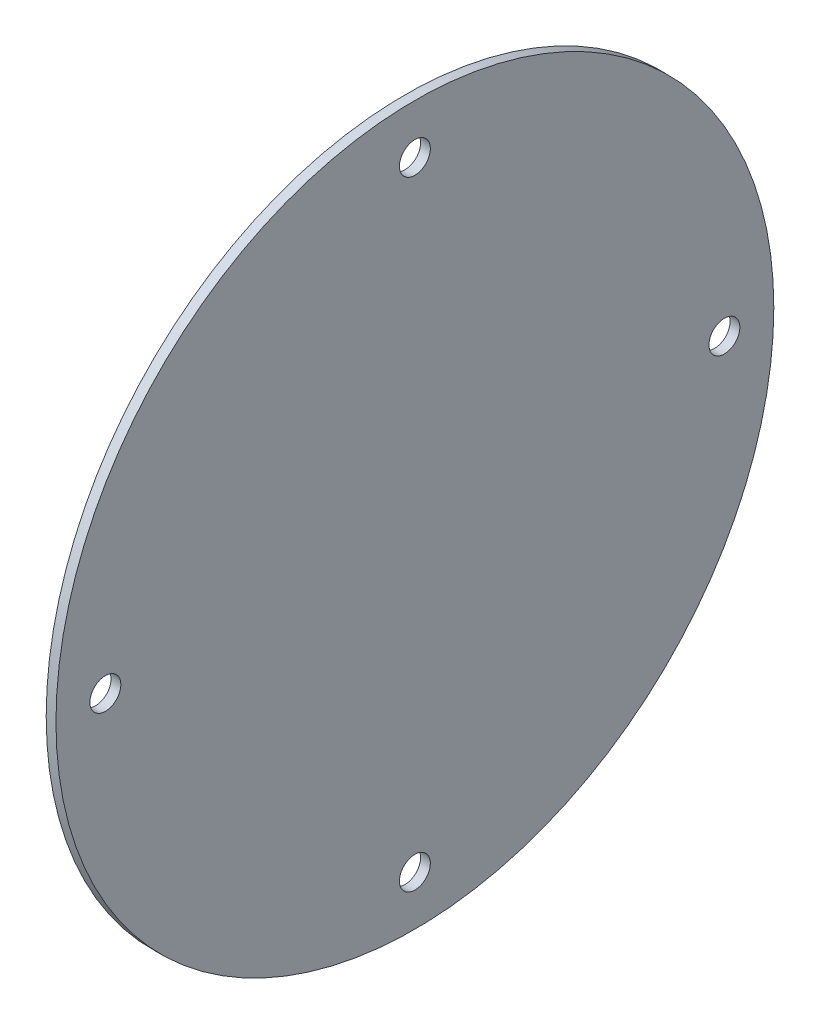
ISO-10303-21;
HEADER;
FILE_DESCRIPTION(('STEP AP214'),'2;1');
FILE_NAME('part.step','',(''),(''),'','','');
FILE_SCHEMA(('AUTOMOTIVE_DESIGN { 1 0 10303 214 1 1 1 1 }'));
ENDSEC;
DATA;
#1=APPLICATION_CONTEXT('core data for automotive mechanical design processes');
#2=APPLICATION_PROTOCOL_DEFINITION('international standard','automotive_design',2000,#1);
#3=PRODUCT_CONTEXT('',#1,'mechanical');
#4=PRODUCT('Part','Part','',(#3));
#5=PRODUCT_RELATED_PRODUCT_CATEGORY('part','',(#4));
#6=PRODUCT_DEFINITION_FORMATION('','',#4);
#7=PRODUCT_DEFINITION_CONTEXT('part definition',#1,'design');
#8=PRODUCT_DEFINITION('design','',#6,#7);
#9=PRODUCT_DEFINITION_SHAPE('','',#8);
#10=(LENGTH_UNIT() NAMED_UNIT(*) SI_UNIT(.MILLI.,.METRE.));
#11=(NAMED_UNIT(*) PLANE_ANGLE_UNIT() SI_UNIT($,.RADIAN.));
#12=(NAMED_UNIT(*) SI_UNIT($,.STERADIAN.) SOLID_ANGLE_UNIT());
#13=UNCERTAINTY_MEASURE_WITH_UNIT(LENGTH_MEASURE(1.E-05),#10,'distance_accuracy_value','');
#14=(GEOMETRIC_REPRESENTATION_CONTEXT(3) GLOBAL_UNCERTAINTY_ASSIGNED_CONTEXT((#13)) GLOBAL_UNIT_ASSIGNED_CONTEXT((#10,
#11,#12)) REPRESENTATION_CONTEXT('',''));
#15=CARTESIAN_POINT('',(0.,0.,0.));
#16=DIRECTION('',(0.,0.,1.));
#17=DIRECTION('',(1.,0.,0.));
#18=AXIS2_PLACEMENT_3D('',#15,#16,#17);
#19=CARTESIAN_POINT('',(2.0066,0.,0.));
#20=DIRECTION('',(-1.,0.,0.));
#21=DIRECTION('',(0.,0.,1.));
#22=AXIS2_PLACEMENT_3D('',#19,#20,#21);
#23=CYLINDRICAL_SURFACE('',#22,73.787);
#24=CARTESIAN_POINT('',(2.0066,0.,0.));
#25=DIRECTION('',(1.,0.,0.));
#26=DIRECTION('',(0.,0.,-1.));
#27=AXIS2_PLACEMENT_3D('',#24,#25,#26);
#28=CIRCLE('',#27,73.787);
#29=CARTESIAN_POINT('',(2.0066,0.,-73.787));
#30=VERTEX_POINT('',#29);
#31=EDGE_CURVE('E11',#30,#30,#28,.T.);
#32=ORIENTED_EDGE('',*,*,#31,.F.);
#33=EDGE_LOOP('',(#32));
#34=FACE_BOUND('',#33,.T.);
#35=CARTESIAN_POINT('',(0.,0.,0.));
#36=DIRECTION('',(1.,0.,0.));
#37=DIRECTION('',(0.,0.,-1.));
#38=AXIS2_PLACEMENT_3D('',#35,#36,#37);
#39=CIRCLE('',#38,73.787);
#40=CARTESIAN_POINT('',(0.,0.,-73.787));
#41=VERTEX_POINT('',#40);
#42=EDGE_CURVE('E49',#41,#41,#39,.T.);
#43=ORIENTED_EDGE('',*,*,#42,.T.);
#44=EDGE_LOOP('',(#43));
#45=FACE_BOUND('',#44,.T.);
#46=ADVANCED_FACE('F46',(#34,#45),#23,.T.);
#47=CARTESIAN_POINT('',(2.0066,0.,0.));
#48=DIRECTION('',(1.,0.,0.));
#49=DIRECTION('',(0.,0.,-1.));
#50=AXIS2_PLACEMENT_3D('',#47,#48,#49);
#51=PLANE('',#50);
#52=CARTESIAN_POINT('',(2.0066,-63.627,-2.22152483146572E-13));
#53=DIRECTION('',(1.,0.,0.));
#54=DIRECTION('',(0.,1.,0.));
#55=AXIS2_PLACEMENT_3D('',#52,#53,#54);
#56=CIRCLE('',#55,3.175);
#57=CARTESIAN_POINT('',(2.0066,-60.452,-2.11067029895745E-13));
#58=VERTEX_POINT('',#57);
#59=EDGE_CURVE('E84',#58,#58,#56,.T.);
#60=ORIENTED_EDGE('',*,*,#59,.F.);
#61=EDGE_LOOP('',(#60));
#62=FACE_BOUND('',#61,.T.);
#63=CARTESIAN_POINT('',(2.0066,0.,-63.627));
#64=DIRECTION('',(1.,0.,0.));
#65=DIRECTION('',(0.,0.,1.));
#66=AXIS2_PLACEMENT_3D('',#63,#64,#65);
#67=CIRCLE('',#66,3.175);
#68=CARTESIAN_POINT('',(2.0066,0.,-60.452));
#69=VERTEX_POINT('',#68);
#70=EDGE_CURVE('E76',#69,#69,#67,.T.);
#71=ORIENTED_EDGE('',*,*,#70,.F.);
#72=EDGE_LOOP('',(#71));
#73=FACE_BOUND('',#72,.T.);
#74=CARTESIAN_POINT('',(2.0066,63.627,6.66457449439716E-13));
#75=DIRECTION('',(1.,0.,0.));
#76=DIRECTION('',(0.,-1.,0.));
#77=AXIS2_PLACEMENT_3D('',#74,#75,#76);
#78=CIRCLE('',#77,3.175);
#79=CARTESIAN_POINT('',(2.0066,60.452,6.33201089687235E-13));
#80=VERTEX_POINT('',#79);
#81=EDGE_CURVE('E68',#80,#80,#78,.T.);
#82=ORIENTED_EDGE('',*,*,#81,.F.);
#83=EDGE_LOOP('',(#82));
#84=FACE_BOUND('',#83,.T.);
#85=CARTESIAN_POINT('',(2.0066,0.,63.627));
#86=DIRECTION('',(1.,0.,0.));
#87=DIRECTION('',(0.,0.,-1.));
#88=AXIS2_PLACEMENT_3D('',#85,#86,#87);
#89=CIRCLE('',#88,3.175);
#90=CARTESIAN_POINT('',(2.0066,0.,60.452));
#91=VERTEX_POINT('',#90);
#92=EDGE_CURVE('E60',#91,#91,#89,.T.);
#93=ORIENTED_EDGE('',*,*,#92,.F.);
#94=EDGE_LOOP('',(#93));
#95=FACE_BOUND('',#94,.T.);
#96=ORIENTED_EDGE('',*,*,#31,.T.);
#97=EDGE_LOOP('',(#96));
#98=FACE_BOUND('',#97,.T.);
#99=ADVANCED_FACE('F102',(#62,#73,#84,#95,#98),#51,.T.);
#100=CARTESIAN_POINT('',(0.,0.,0.));
#101=DIRECTION('',(1.,0.,0.));
#102=DIRECTION('',(0.,0.,-1.));
#103=AXIS2_PLACEMENT_3D('',#100,#101,#102);
#104=PLANE('',#103);
#105=CARTESIAN_POINT('',(0.,-63.627,-2.22152483146572E-13));
#106=DIRECTION('',(1.,0.,0.));
#107=DIRECTION('',(0.,1.,0.));
#108=AXIS2_PLACEMENT_3D('',#105,#106,#107);
#109=CIRCLE('',#108,3.175);
#110=CARTESIAN_POINT('',(0.,-60.452,-2.11067029895745E-13));
#111=VERTEX_POINT('',#110);
#112=EDGE_CURVE('E64',#111,#111,#109,.T.);
#113=ORIENTED_EDGE('',*,*,#112,.T.);
#114=EDGE_LOOP('',(#113));
#115=FACE_BOUND('',#114,.T.);
#116=CARTESIAN_POINT('',(0.,0.,-63.627));
#117=DIRECTION('',(1.,0.,0.));
#118=DIRECTION('',(0.,0.,1.));
#119=AXIS2_PLACEMENT_3D('',#116,#117,#118);
#120=CIRCLE('',#119,3.175);
#121=CARTESIAN_POINT('',(0.,0.,-60.452));
#122=VERTEX_POINT('',#121);
#123=EDGE_CURVE('E80',#122,#122,#120,.T.);
#124=ORIENTED_EDGE('',*,*,#123,.T.);
#125=EDGE_LOOP('',(#124));
#126=FACE_BOUND('',#125,.T.);
#127=CARTESIAN_POINT('',(0.,63.627,6.66457449439716E-13));
#128=DIRECTION('',(1.,0.,0.));
#129=DIRECTION('',(0.,-1.,0.));
#130=AXIS2_PLACEMENT_3D('',#127,#128,#129);
#131=CIRCLE('',#130,3.175);
#132=CARTESIAN_POINT('',(0.,60.452,6.33201089687235E-13));
#133=VERTEX_POINT('',#132);
#134=EDGE_CURVE('E72',#133,#133,#131,.T.);
#135=ORIENTED_EDGE('',*,*,#134,.T.);
#136=EDGE_LOOP('',(#135));
#137=FACE_BOUND('',#136,.T.);
#138=CARTESIAN_POINT('',(0.,0.,63.627));
#139=DIRECTION('',(1.,0.,0.));
#140=DIRECTION('',(0.,0.,-1.));
#141=AXIS2_PLACEMENT_3D('',#138,#139,#140);
#142=CIRCLE('',#141,3.175);
#143=CARTESIAN_POINT('',(0.,0.,60.452));
#144=VERTEX_POINT('',#143);
#145=EDGE_CURVE('E58',#144,#144,#142,.T.);
#146=ORIENTED_EDGE('',*,*,#145,.T.);
#147=EDGE_LOOP('',(#146));
#148=FACE_BOUND('',#147,.T.);
#149=ORIENTED_EDGE('',*,*,#42,.F.);
#150=EDGE_LOOP('',(#149));
#151=FACE_BOUND('',#150,.T.);
#152=ADVANCED_FACE('F92',(#115,#126,#137,#148,#151),#104,.F.);
#153=CARTESIAN_POINT('',(0.,0.,63.627));
#154=DIRECTION('',(1.,0.,0.));
#155=DIRECTION('',(0.,0.,-1.));
#156=AXIS2_PLACEMENT_3D('',#153,#154,#155);
#157=CYLINDRICAL_SURFACE('',#156,3.175);
#158=ORIENTED_EDGE('',*,*,#145,.F.);
#159=EDGE_LOOP('',(#158));
#160=FACE_BOUND('',#159,.T.);
#161=ORIENTED_EDGE('',*,*,#92,.T.);
#162=EDGE_LOOP('',(#161));
#163=FACE_BOUND('',#162,.T.);
#164=ADVANCED_FACE('F112',(#160,#163),#157,.F.);
#165=CARTESIAN_POINT('',(0.,63.627,6.66457449439716E-13));
#166=DIRECTION('',(1.,0.,0.));
#167=DIRECTION('',(0.,0.,-1.));
#168=AXIS2_PLACEMENT_3D('',#165,#166,#167);
#169=CYLINDRICAL_SURFACE('',#168,3.175);
#170=ORIENTED_EDGE('',*,*,#134,.F.);
#171=EDGE_LOOP('',(#170));
#172=FACE_BOUND('',#171,.T.);
#173=ORIENTED_EDGE('',*,*,#81,.T.);
#174=EDGE_LOOP('',(#173));
#175=FACE_BOUND('',#174,.T.);
#176=ADVANCED_FACE('F114',(#172,#175),#169,.F.);
#177=CARTESIAN_POINT('',(0.,0.,-63.627));
#178=DIRECTION('',(1.,0.,0.));
#179=DIRECTION('',(0.,0.,-1.));
#180=AXIS2_PLACEMENT_3D('',#177,#178,#179);
#181=CYLINDRICAL_SURFACE('',#180,3.175);
#182=ORIENTED_EDGE('',*,*,#123,.F.);
#183=EDGE_LOOP('',(#182));
#184=FACE_BOUND('',#183,.T.);
#185=ORIENTED_EDGE('',*,*,#70,.T.);
#186=EDGE_LOOP('',(#185));
#187=FACE_BOUND('',#186,.T.);
#188=ADVANCED_FACE('F98',(#184,#187),#181,.F.);
#189=CARTESIAN_POINT('',(0.,-63.627,-2.22152483146572E-13));
#190=DIRECTION('',(1.,0.,0.));
#191=DIRECTION('',(0.,0.,-1.));
#192=AXIS2_PLACEMENT_3D('',#189,#190,#191);
#193=CYLINDRICAL_SURFACE('',#192,3.175);
#194=ORIENTED_EDGE('',*,*,#112,.F.);
#195=EDGE_LOOP('',(#194));
#196=FACE_BOUND('',#195,.T.);
#197=ORIENTED_EDGE('',*,*,#59,.T.);
#198=EDGE_LOOP('',(#197));
#199=FACE_BOUND('',#198,.T.);
#200=ADVANCED_FACE('F95',(#196,#199),#193,.F.);
#201=CLOSED_SHELL('',(#46,#99,#152,#164,#176,#188,#200));
#202=MANIFOLD_SOLID_BREP('B2',#201);
#203=ADVANCED_BREP_SHAPE_REPRESENTATION('',(#18,#202),#14);
#204=SHAPE_DEFINITION_REPRESENTATION(#9,#203);
ENDSEC;
END-ISO-10303-21;
